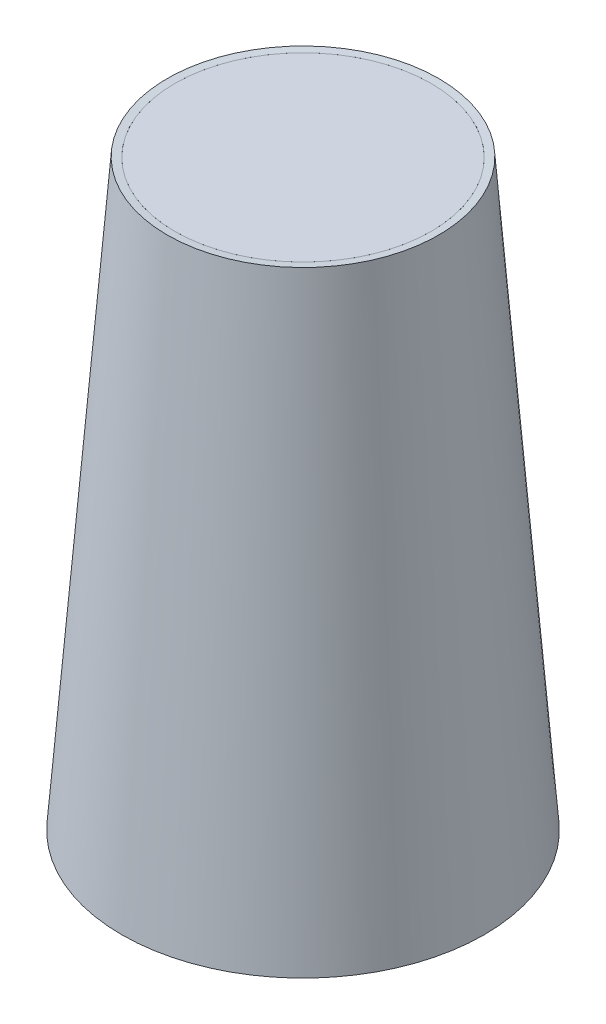
ISO-10303-21;
HEADER;
FILE_DESCRIPTION(('STEP AP214'),'2;1');
FILE_NAME('part.step','',(''),(''),'','','');
FILE_SCHEMA(('AUTOMOTIVE_DESIGN { 1 0 10303 214 1 1 1 1 }'));
ENDSEC;
DATA;
#1=APPLICATION_CONTEXT('core data for automotive mechanical design processes');
#2=APPLICATION_PROTOCOL_DEFINITION('international standard','automotive_design',2000,#1);
#3=PRODUCT_CONTEXT('',#1,'mechanical');
#4=PRODUCT('Part','Part','',(#3));
#5=PRODUCT_RELATED_PRODUCT_CATEGORY('part','',(#4));
#6=PRODUCT_DEFINITION_FORMATION('','',#4);
#7=PRODUCT_DEFINITION_CONTEXT('part definition',#1,'design');
#8=PRODUCT_DEFINITION('design','',#6,#7);
#9=PRODUCT_DEFINITION_SHAPE('','',#8);
#10=(LENGTH_UNIT() NAMED_UNIT(*) SI_UNIT(.MILLI.,.METRE.));
#11=(NAMED_UNIT(*) PLANE_ANGLE_UNIT() SI_UNIT($,.RADIAN.));
#12=(NAMED_UNIT(*) SI_UNIT($,.STERADIAN.) SOLID_ANGLE_UNIT());
#13=UNCERTAINTY_MEASURE_WITH_UNIT(LENGTH_MEASURE(1.E-05),#10,'distance_accuracy_value','');
#14=(GEOMETRIC_REPRESENTATION_CONTEXT(3) GLOBAL_UNCERTAINTY_ASSIGNED_CONTEXT((#13)) GLOBAL_UNIT_ASSIGNED_CONTEXT((#10,
#11,#12)) REPRESENTATION_CONTEXT('',''));
#15=CARTESIAN_POINT('',(0.,0.,0.));
#16=DIRECTION('',(0.,0.,1.));
#17=DIRECTION('',(1.,0.,0.));
#18=AXIS2_PLACEMENT_3D('',#15,#16,#17);
#19=CARTESIAN_POINT('',(-379.779335290374,44.7290082660876,237.879067035651));
#20=DIRECTION('',(0.,-1.,0.));
#21=DIRECTION('',(0.,0.,-1.));
#22=AXIS2_PLACEMENT_3D('',#19,#20,#21);
#23=CONICAL_SURFACE('',#22,27.,0.078016217564139);
#24=CARTESIAN_POINT('',(-379.779335290374,-71.3169353120203,237.879067035651));
#25=DIRECTION('',(0.,1.,0.));
#26=DIRECTION('',(0.,0.,1.));
#27=AXIS2_PLACEMENT_3D('',#24,#25,#26);
#28=CIRCLE('',#27,36.0718784750795);
#29=CARTESIAN_POINT('',(-379.779335290374,-71.3169353120203,273.950945510731));
#30=VERTEX_POINT('',#29);
#31=EDGE_CURVE('E11',#30,#30,#28,.T.);
#32=ORIENTED_EDGE('',*,*,#31,.T.);
#33=EDGE_LOOP('',(#32));
#34=FACE_BOUND('',#33,.T.);
#35=CARTESIAN_POINT('',(-379.779335290374,44.7290082660876,237.879067035651));
#36=DIRECTION('',(0.,1.,0.));
#37=DIRECTION('',(0.,0.,1.));
#38=AXIS2_PLACEMENT_3D('',#35,#36,#37);
#39=CIRCLE('',#38,27.);
#40=CARTESIAN_POINT('',(-379.779335290374,44.7290082660876,264.879067035651));
#41=VERTEX_POINT('',#40);
#42=EDGE_CURVE('E57',#41,#41,#39,.T.);
#43=ORIENTED_EDGE('',*,*,#42,.F.);
#44=EDGE_LOOP('',(#43));
#45=FACE_BOUND('',#44,.T.);
#46=ADVANCED_FACE('F43',(#34,#45),#23,.T.);
#47=CARTESIAN_POINT('',(-379.779335290374,-71.3169353120203,237.879067035651));
#48=DIRECTION('',(0.,1.,0.));
#49=DIRECTION('',(0.,0.,1.));
#50=AXIS2_PLACEMENT_3D('',#47,#48,#49);
#51=CONICAL_SURFACE('',#50,36.0718784750795,1.49278010923079);
#52=CARTESIAN_POINT('',(-379.779335290374,-71.4338409624723,237.879067035651));
#53=DIRECTION('',(0.,1.,0.));
#54=DIRECTION('',(0.,0.,1.));
#55=AXIS2_PLACEMENT_3D('',#52,#53,#54);
#56=CIRCLE('',#55,34.5764410578358);
#57=CARTESIAN_POINT('',(-379.779335290374,-71.4338409624723,272.455508093487));
#58=VERTEX_POINT('',#57);
#59=EDGE_CURVE('E49',#58,#58,#56,.T.);
#60=ORIENTED_EDGE('',*,*,#59,.T.);
#61=EDGE_LOOP('',(#60));
#62=FACE_BOUND('',#61,.T.);
#63=ORIENTED_EDGE('',*,*,#31,.F.);
#64=EDGE_LOOP('',(#63));
#65=FACE_BOUND('',#64,.T.);
#66=ADVANCED_FACE('F67',(#62,#65),#51,.T.);
#67=CARTESIAN_POINT('',(-379.779335290374,-71.4338409624723,237.879067035651));
#68=DIRECTION('',(0.,-1.,0.));
#69=DIRECTION('',(0.,0.,-1.));
#70=AXIS2_PLACEMENT_3D('',#67,#68,#69);
#71=CONICAL_SURFACE('',#70,34.5764410578358,0.0780162175641385);
#72=CARTESIAN_POINT('',(-379.779335290374,44.6121026156355,237.879067035651));
#73=DIRECTION('',(0.,1.,0.));
#74=DIRECTION('',(0.,0.,1.));
#75=AXIS2_PLACEMENT_3D('',#72,#73,#74);
#76=CIRCLE('',#75,25.5045625827563);
#77=CARTESIAN_POINT('',(-379.779335290374,44.6121026156355,263.383629618408));
#78=VERTEX_POINT('',#77);
#79=EDGE_CURVE('E53',#78,#78,#76,.T.);
#80=ORIENTED_EDGE('',*,*,#79,.T.);
#81=EDGE_LOOP('',(#80));
#82=FACE_BOUND('',#81,.T.);
#83=ORIENTED_EDGE('',*,*,#59,.F.);
#84=EDGE_LOOP('',(#83));
#85=FACE_BOUND('',#84,.T.);
#86=ADVANCED_FACE('F71',(#82,#85),#71,.F.);
#87=CARTESIAN_POINT('',(-379.779335290374,44.6121026156355,237.879067035651));
#88=DIRECTION('',(0.,1.,0.));
#89=DIRECTION('',(0.,0.,1.));
#90=AXIS2_PLACEMENT_3D('',#87,#88,#89);
#91=CONICAL_SURFACE('',#90,25.5045625827563,1.49278010923076);
#92=ORIENTED_EDGE('',*,*,#42,.T.);
#93=EDGE_LOOP('',(#92));
#94=FACE_BOUND('',#93,.T.);
#95=ORIENTED_EDGE('',*,*,#79,.F.);
#96=EDGE_LOOP('',(#95));
#97=FACE_BOUND('',#96,.T.);
#98=ADVANCED_FACE('F63',(#94,#97),#91,.F.);
#99=CLOSED_SHELL('',(#46,#66,#86,#98));
#100=MANIFOLD_SOLID_BREP('B2',#99);
#101=CARTESIAN_POINT('',(-379.779335290374,44.6121026156355,237.879067035651));
#102=DIRECTION('',(0.,-1.,0.));
#103=DIRECTION('',(0.,0.,-1.));
#104=AXIS2_PLACEMENT_3D('',#101,#102,#103);
#105=CYLINDRICAL_SURFACE('',#104,25.5);
#106=CARTESIAN_POINT('',(-379.779335290374,44.6121026156355,237.879067035651));
#107=DIRECTION('',(0.,-1.,0.));
#108=DIRECTION('',(0.,0.,-1.));
#109=AXIS2_PLACEMENT_3D('',#106,#107,#108);
#110=CIRCLE('',#109,25.5);
#111=CARTESIAN_POINT('',(-379.779335290374,44.6121026156355,212.379067035651));
#112=VERTEX_POINT('',#111);
#113=EDGE_CURVE('E42',#112,#112,#110,.T.);
#114=ORIENTED_EDGE('',*,*,#113,.T.);
#115=EDGE_LOOP('',(#114));
#116=FACE_BOUND('',#115,.T.);
#117=CARTESIAN_POINT('',(-379.779335290374,43.1121026156355,237.879067035651));
#118=DIRECTION('',(0.,-1.,0.));
#119=DIRECTION('',(0.,0.,-1.));
#120=AXIS2_PLACEMENT_3D('',#117,#118,#119);
#121=CIRCLE('',#120,25.5);
#122=CARTESIAN_POINT('',(-379.779335290374,43.1121026156355,212.379067035651));
#123=VERTEX_POINT('',#122);
#124=EDGE_CURVE('E111',#123,#123,#121,.T.);
#125=ORIENTED_EDGE('',*,*,#124,.F.);
#126=EDGE_LOOP('',(#125));
#127=FACE_BOUND('',#126,.T.);
#128=ADVANCED_FACE('F105',(#116,#127),#105,.T.);
#129=CARTESIAN_POINT('',(-354.279335290374,44.6121026156355,237.879067035651));
#130=DIRECTION('',(0.,1.,0.));
#131=DIRECTION('',(0.,0.,1.));
#132=AXIS2_PLACEMENT_3D('',#129,#130,#131);
#133=PLANE('',#132);
#134=ORIENTED_EDGE('',*,*,#113,.F.);
#135=EDGE_LOOP('',(#134));
#136=FACE_BOUND('',#135,.T.);
#137=ADVANCED_FACE('F120',(#136),#133,.T.);
#138=CARTESIAN_POINT('',(-379.779335290374,43.1121026156355,237.879067035651));
#139=DIRECTION('',(0.,-1.,0.));
#140=DIRECTION('',(0.,0.,-1.));
#141=AXIS2_PLACEMENT_3D('',#138,#139,#140);
#142=PLANE('',#141);
#143=ORIENTED_EDGE('',*,*,#124,.T.);
#144=EDGE_LOOP('',(#143));
#145=FACE_BOUND('',#144,.T.);
#146=ADVANCED_FACE('F117',(#145),#142,.T.);
#147=CLOSED_SHELL('',(#128,#137,#146));
#148=MANIFOLD_SOLID_BREP('B6',#147);
#149=ADVANCED_BREP_SHAPE_REPRESENTATION('',(#18,#100,#148),#14);
#150=SHAPE_DEFINITION_REPRESENTATION(#9,#149);
ENDSEC;
END-ISO-10303-21;
